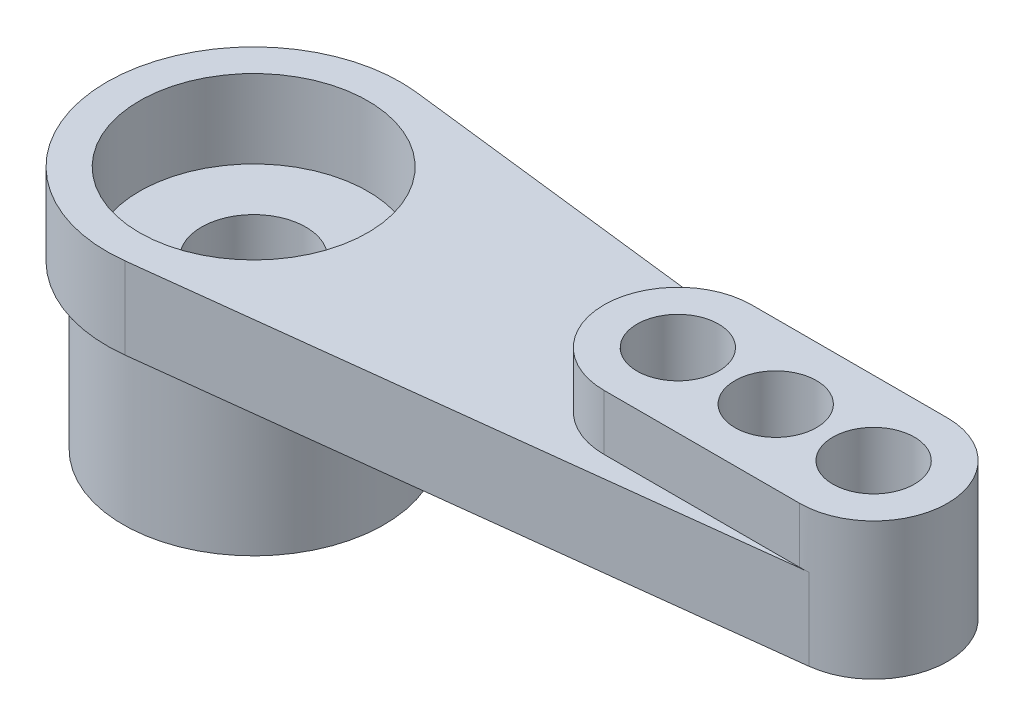
ISO-10303-21;
HEADER;
FILE_DESCRIPTION(('STEP AP214'),'2;1');
FILE_NAME('part.step','',(''),(''),'','','');
FILE_SCHEMA(('AUTOMOTIVE_DESIGN { 1 0 10303 214 1 1 1 1 }'));
ENDSEC;
DATA;
#1=APPLICATION_CONTEXT('core data for automotive mechanical design processes');
#2=APPLICATION_PROTOCOL_DEFINITION('international standard','automotive_design',2000,#1);
#3=PRODUCT_CONTEXT('',#1,'mechanical');
#4=PRODUCT('Part','Part','',(#3));
#5=PRODUCT_RELATED_PRODUCT_CATEGORY('part','',(#4));
#6=PRODUCT_DEFINITION_FORMATION('','',#4);
#7=PRODUCT_DEFINITION_CONTEXT('part definition',#1,'design');
#8=PRODUCT_DEFINITION('design','',#6,#7);
#9=PRODUCT_DEFINITION_SHAPE('','',#8);
#10=(LENGTH_UNIT() NAMED_UNIT(*) SI_UNIT(.MILLI.,.METRE.));
#11=(NAMED_UNIT(*) PLANE_ANGLE_UNIT() SI_UNIT($,.RADIAN.));
#12=(NAMED_UNIT(*) SI_UNIT($,.STERADIAN.) SOLID_ANGLE_UNIT());
#13=UNCERTAINTY_MEASURE_WITH_UNIT(LENGTH_MEASURE(1.E-05),#10,'distance_accuracy_value','');
#14=(GEOMETRIC_REPRESENTATION_CONTEXT(3) GLOBAL_UNCERTAINTY_ASSIGNED_CONTEXT((#13)) GLOBAL_UNIT_ASSIGNED_CONTEXT((#10,
#11,#12)) REPRESENTATION_CONTEXT('',''));
#15=CARTESIAN_POINT('',(0.,0.,0.));
#16=DIRECTION('',(0.,0.,1.));
#17=DIRECTION('',(1.,0.,0.));
#18=AXIS2_PLACEMENT_3D('',#15,#16,#17);
#19=CARTESIAN_POINT('',(0.,2.5,0.));
#20=DIRECTION('',(0.,-1.,0.));
#21=DIRECTION('',(0.,0.,-1.));
#22=AXIS2_PLACEMENT_3D('',#19,#20,#21);
#23=CYLINDRICAL_SURFACE('',#22,4.5);
#24=CARTESIAN_POINT('',(0.,0.,0.));
#25=DIRECTION('',(0.,1.,0.));
#26=DIRECTION('',(0.,0.,1.));
#27=AXIS2_PLACEMENT_3D('',#24,#25,#26);
#28=CIRCLE('',#27,4.5);
#29=CARTESIAN_POINT('',(0.529171571059011,0.,-4.46877807105957));
#30=VERTEX_POINT('',#29);
#31=CARTESIAN_POINT('',(0.529171571059011,0.,4.46877807105957));
#32=VERTEX_POINT('',#31);
#33=EDGE_CURVE('E144',#30,#32,#28,.T.);
#34=ORIENTED_EDGE('',*,*,#33,.T.);
#35=DIRECTION('',(0.,-1.,0.));
#36=VECTOR('',#35,1.);
#37=CARTESIAN_POINT('',(0.529171571059011,2.5,4.46877807105957));
#38=LINE('',#37,#36);
#39=CARTESIAN_POINT('',(0.529171571059011,2.5,4.46877807105957));
#40=VERTEX_POINT('',#39);
#41=EDGE_CURVE('E147',#40,#32,#38,.T.);
#42=ORIENTED_EDGE('',*,*,#41,.F.);
#43=CARTESIAN_POINT('',(0.,2.5,0.));
#44=DIRECTION('',(0.,1.,0.));
#45=DIRECTION('',(0.,0.,1.));
#46=AXIS2_PLACEMENT_3D('',#43,#44,#45);
#47=CIRCLE('',#46,4.5);
#48=CARTESIAN_POINT('',(0.529171571059011,2.5,-4.46877807105957));
#49=VERTEX_POINT('',#48);
#50=EDGE_CURVE('E148',#49,#40,#47,.T.);
#51=ORIENTED_EDGE('',*,*,#50,.F.);
#52=DIRECTION('',(0.,-1.,0.));
#53=VECTOR('',#52,1.);
#54=CARTESIAN_POINT('',(0.529171571059011,2.5,-4.46877807105957));
#55=LINE('',#54,#53);
#56=EDGE_CURVE('E156',#49,#30,#55,.T.);
#57=ORIENTED_EDGE('',*,*,#56,.T.);
#58=EDGE_LOOP('',(#34,#42,#51,#57));
#59=FACE_BOUND('',#58,.T.);
#60=ADVANCED_FACE('F33',(#59),#23,.T.);
#61=CARTESIAN_POINT('',(0.529171571059011,2.5,4.46877807105957));
#62=DIRECTION('',(-0.117593682457558,0.,-0.993061793568795));
#63=DIRECTION('',(-0.993061793568795,0.,0.117593682457558));
#64=AXIS2_PLACEMENT_3D('',#61,#62,#63);
#65=PLANE('',#64);
#66=DIRECTION('',(0.993061793568795,0.,-0.117593682457558));
#67=VECTOR('',#66,1.);
#68=CARTESIAN_POINT('',(0.529171571059011,0.,4.46877807105957));
#69=LINE('',#68,#67);
#70=CARTESIAN_POINT('',(19.2664343621344,0.,2.25));
#71=VERTEX_POINT('',#70);
#72=EDGE_CURVE('E159',#32,#71,#69,.T.);
#73=ORIENTED_EDGE('',*,*,#72,.T.);
#74=DIRECTION('',(0.,-1.,0.));
#75=VECTOR('',#74,1.);
#76=CARTESIAN_POINT('',(19.2664343621344,2.5,2.25));
#77=LINE('',#76,#75);
#78=CARTESIAN_POINT('',(19.2664343621344,2.5,2.25));
#79=VERTEX_POINT('',#78);
#80=EDGE_CURVE('E169',#79,#71,#77,.T.);
#81=ORIENTED_EDGE('',*,*,#80,.F.);
#82=DIRECTION('',(0.993061793568795,0.,-0.117593682457558));
#83=VECTOR('',#82,1.);
#84=CARTESIAN_POINT('',(0.529171571059011,2.5,4.46877807105957));
#85=LINE('',#84,#83);
#86=EDGE_CURVE('E151',#40,#79,#85,.T.);
#87=ORIENTED_EDGE('',*,*,#86,.F.);
#88=ORIENTED_EDGE('',*,*,#41,.T.);
#89=EDGE_LOOP('',(#73,#81,#87,#88));
#90=FACE_BOUND('',#89,.T.);
#91=ADVANCED_FACE('F221',(#90),#65,.F.);
#92=CARTESIAN_POINT('',(19.,2.5,0.));
#93=DIRECTION('',(0.,-1.,0.));
#94=DIRECTION('',(0.,0.,-1.));
#95=AXIS2_PLACEMENT_3D('',#92,#93,#94);
#96=CYLINDRICAL_SURFACE('',#95,2.2657200333064);
#97=CARTESIAN_POINT('',(19.,0.,0.));
#98=DIRECTION('',(0.,1.,0.));
#99=DIRECTION('',(0.,0.,-1.));
#100=AXIS2_PLACEMENT_3D('',#97,#98,#99);
#101=CIRCLE('',#100,2.2657200333064);
#102=CARTESIAN_POINT('',(19.2664343621344,0.,-2.25));
#103=VERTEX_POINT('',#102);
#104=EDGE_CURVE('E161',#71,#103,#101,.T.);
#105=ORIENTED_EDGE('',*,*,#104,.T.);
#106=DIRECTION('',(0.,-1.,0.));
#107=VECTOR('',#106,1.);
#108=CARTESIAN_POINT('',(19.2664343621344,2.5,-2.25));
#109=LINE('',#108,#107);
#110=CARTESIAN_POINT('',(19.2664343621344,2.5,-2.25));
#111=VERTEX_POINT('',#110);
#112=EDGE_CURVE('E166',#111,#103,#109,.T.);
#113=ORIENTED_EDGE('',*,*,#112,.F.);
#114=CARTESIAN_POINT('',(19.,2.5,0.));
#115=DIRECTION('',(0.,1.,0.));
#116=DIRECTION('',(0.,0.,1.));
#117=AXIS2_PLACEMENT_3D('',#114,#115,#116);
#118=CIRCLE('',#117,2.2657200333064);
#119=CARTESIAN_POINT('',(19.,2.5,-2.2657200333064));
#120=VERTEX_POINT('',#119);
#121=EDGE_CURVE('E11',#111,#120,#118,.T.);
#122=ORIENTED_EDGE('',*,*,#121,.T.);
#123=DIRECTION('',(0.,-1.,0.));
#124=VECTOR('',#123,1.);
#125=CARTESIAN_POINT('',(19.,4.2,-2.2657200333064));
#126=LINE('',#125,#124);
#127=CARTESIAN_POINT('',(19.,4.2,-2.2657200333064));
#128=VERTEX_POINT('',#127);
#129=EDGE_CURVE('E102',#128,#120,#126,.T.);
#130=ORIENTED_EDGE('',*,*,#129,.F.);
#131=CARTESIAN_POINT('',(19.,4.2,0.));
#132=DIRECTION('',(0.,1.,0.));
#133=DIRECTION('',(0.,0.,1.));
#134=AXIS2_PLACEMENT_3D('',#131,#132,#133);
#135=CIRCLE('',#134,2.2657200333064);
#136=CARTESIAN_POINT('',(19.,4.2,2.2657200333064));
#137=VERTEX_POINT('',#136);
#138=EDGE_CURVE('E108',#137,#128,#135,.T.);
#139=ORIENTED_EDGE('',*,*,#138,.F.);
#140=DIRECTION('',(0.,-1.,0.));
#141=VECTOR('',#140,1.);
#142=CARTESIAN_POINT('',(19.,4.2,2.2657200333064));
#143=LINE('',#142,#141);
#144=CARTESIAN_POINT('',(19.,2.5,2.2657200333064));
#145=VERTEX_POINT('',#144);
#146=EDGE_CURVE('E231',#137,#145,#143,.T.);
#147=ORIENTED_EDGE('',*,*,#146,.T.);
#148=EDGE_CURVE('E43',#145,#79,#118,.T.);
#149=ORIENTED_EDGE('',*,*,#148,.T.);
#150=ORIENTED_EDGE('',*,*,#80,.T.);
#151=EDGE_LOOP('',(#105,#113,#122,#130,#139,#147,#149,#150));
#152=FACE_BOUND('',#151,.T.);
#153=ADVANCED_FACE('F118',(#152),#96,.T.);
#154=CARTESIAN_POINT('',(0.529171571059011,2.5,-4.46877807105957));
#155=DIRECTION('',(-0.117593682457558,0.,0.993061793568795));
#156=DIRECTION('',(0.993061793568795,0.,0.117593682457558));
#157=AXIS2_PLACEMENT_3D('',#154,#155,#156);
#158=PLANE('',#157);
#159=DIRECTION('',(-0.993061793568795,0.,-0.117593682457558));
#160=VECTOR('',#159,1.);
#161=CARTESIAN_POINT('',(0.529171571059011,0.,-4.46877807105957));
#162=LINE('',#161,#160);
#163=EDGE_CURVE('E152',#103,#30,#162,.T.);
#164=ORIENTED_EDGE('',*,*,#163,.T.);
#165=ORIENTED_EDGE('',*,*,#56,.F.);
#166=DIRECTION('',(-0.993061793568795,0.,-0.117593682457558));
#167=VECTOR('',#166,1.);
#168=CARTESIAN_POINT('',(0.529171571059011,2.5,-4.46877807105957));
#169=LINE('',#168,#167);
#170=EDGE_CURVE('E154',#111,#49,#169,.T.);
#171=ORIENTED_EDGE('',*,*,#170,.F.);
#172=ORIENTED_EDGE('',*,*,#112,.T.);
#173=EDGE_LOOP('',(#164,#165,#171,#172));
#174=FACE_BOUND('',#173,.T.);
#175=ADVANCED_FACE('F218',(#174),#158,.F.);
#176=CARTESIAN_POINT('',(0.,2.5,0.));
#177=DIRECTION('',(0.,1.,0.));
#178=DIRECTION('',(0.,0.,1.));
#179=AXIS2_PLACEMENT_3D('',#176,#177,#178);
#180=PLANE('',#179);
#181=ORIENTED_EDGE('',*,*,#148,.F.);
#182=DIRECTION('',(1.,0.,0.));
#183=VECTOR('',#182,1.);
#184=CARTESIAN_POINT('',(19.,2.5,2.2657200333064));
#185=LINE('',#184,#183);
#186=CARTESIAN_POINT('',(13.,2.5,2.2657200333064));
#187=VERTEX_POINT('',#186);
#188=EDGE_CURVE('E53',#187,#145,#185,.T.);
#189=ORIENTED_EDGE('',*,*,#188,.F.);
#190=CARTESIAN_POINT('',(13.,2.5,0.));
#191=DIRECTION('',(0.,1.,0.));
#192=DIRECTION('',(0.,0.,1.));
#193=AXIS2_PLACEMENT_3D('',#190,#191,#192);
#194=CIRCLE('',#193,2.2657200333064);
#195=CARTESIAN_POINT('',(13.,2.5,-2.2657200333064));
#196=VERTEX_POINT('',#195);
#197=EDGE_CURVE('E224',#196,#187,#194,.T.);
#198=ORIENTED_EDGE('',*,*,#197,.F.);
#199=DIRECTION('',(-1.,0.,0.));
#200=VECTOR('',#199,1.);
#201=CARTESIAN_POINT('',(19.,2.5,-2.2657200333064));
#202=LINE('',#201,#200);
#203=EDGE_CURVE('E223',#120,#196,#202,.T.);
#204=ORIENTED_EDGE('',*,*,#203,.F.);
#205=ORIENTED_EDGE('',*,*,#121,.F.);
#206=ORIENTED_EDGE('',*,*,#170,.T.);
#207=ORIENTED_EDGE('',*,*,#50,.T.);
#208=ORIENTED_EDGE('',*,*,#86,.T.);
#209=EDGE_LOOP('',(#181,#189,#198,#204,#205,#206,#207,#208));
#210=FACE_BOUND('',#209,.T.);
#211=CARTESIAN_POINT('',(0.,2.5,0.));
#212=DIRECTION('',(0.,1.,0.));
#213=DIRECTION('',(0.,0.,1.));
#214=AXIS2_PLACEMENT_3D('',#211,#212,#213);
#215=CIRCLE('',#214,3.5);
#216=CARTESIAN_POINT('',(0.,2.5,3.5));
#217=VERTEX_POINT('',#216);
#218=EDGE_CURVE('E120',#217,#217,#215,.T.);
#219=ORIENTED_EDGE('',*,*,#218,.F.);
#220=EDGE_LOOP('',(#219));
#221=FACE_BOUND('',#220,.T.);
#222=ADVANCED_FACE('F206',(#210,#221),#180,.T.);
#223=CARTESIAN_POINT('',(0.,0.,0.));
#224=DIRECTION('',(0.,1.,0.));
#225=DIRECTION('',(0.,0.,1.));
#226=AXIS2_PLACEMENT_3D('',#223,#224,#225);
#227=PLANE('',#226);
#228=CARTESIAN_POINT('',(13.,0.,0.));
#229=DIRECTION('',(0.,1.,0.));
#230=DIRECTION('',(0.,0.,1.));
#231=AXIS2_PLACEMENT_3D('',#228,#229,#230);
#232=CIRCLE('',#231,1.24999999999999);
#233=CARTESIAN_POINT('',(13.,0.,1.24999999999999));
#234=VERTEX_POINT('',#233);
#235=EDGE_CURVE('E248',#234,#234,#232,.T.);
#236=ORIENTED_EDGE('',*,*,#235,.T.);
#237=EDGE_LOOP('',(#236));
#238=FACE_BOUND('',#237,.T.);
#239=CARTESIAN_POINT('',(16.,0.,0.));
#240=DIRECTION('',(0.,1.,0.));
#241=DIRECTION('',(0.,0.,1.));
#242=AXIS2_PLACEMENT_3D('',#239,#240,#241);
#243=CIRCLE('',#242,1.24999999999999);
#244=CARTESIAN_POINT('',(16.,0.,1.24999999999999));
#245=VERTEX_POINT('',#244);
#246=EDGE_CURVE('E36',#245,#245,#243,.T.);
#247=ORIENTED_EDGE('',*,*,#246,.T.);
#248=EDGE_LOOP('',(#247));
#249=FACE_BOUND('',#248,.T.);
#250=CARTESIAN_POINT('',(19.,0.,0.));
#251=DIRECTION('',(0.,1.,0.));
#252=DIRECTION('',(0.,0.,1.));
#253=AXIS2_PLACEMENT_3D('',#250,#251,#252);
#254=CIRCLE('',#253,1.24999999999999);
#255=CARTESIAN_POINT('',(19.,0.,1.24999999999999));
#256=VERTEX_POINT('',#255);
#257=EDGE_CURVE('E227',#256,#256,#254,.T.);
#258=ORIENTED_EDGE('',*,*,#257,.T.);
#259=EDGE_LOOP('',(#258));
#260=FACE_BOUND('',#259,.T.);
#261=CARTESIAN_POINT('',(0.,0.,0.));
#262=DIRECTION('',(0.,-1.,0.));
#263=DIRECTION('',(0.,0.,-1.));
#264=AXIS2_PLACEMENT_3D('',#261,#262,#263);
#265=CIRCLE('',#264,4.);
#266=CARTESIAN_POINT('',(0.,0.,-4.));
#267=VERTEX_POINT('',#266);
#268=EDGE_CURVE('E41',#267,#267,#265,.T.);
#269=ORIENTED_EDGE('',*,*,#268,.F.);
#270=EDGE_LOOP('',(#269));
#271=FACE_BOUND('',#270,.T.);
#272=ORIENTED_EDGE('',*,*,#33,.F.);
#273=ORIENTED_EDGE('',*,*,#163,.F.);
#274=ORIENTED_EDGE('',*,*,#104,.F.);
#275=ORIENTED_EDGE('',*,*,#72,.F.);
#276=EDGE_LOOP('',(#272,#273,#274,#275));
#277=FACE_BOUND('',#276,.T.);
#278=ADVANCED_FACE('F200',(#238,#249,#260,#271,#277),#227,.F.);
#279=CARTESIAN_POINT('',(0.,-5.,0.));
#280=DIRECTION('',(0.,1.,0.));
#281=DIRECTION('',(0.,0.,1.));
#282=AXIS2_PLACEMENT_3D('',#279,#280,#281);
#283=CYLINDRICAL_SURFACE('',#282,4.);
#284=CARTESIAN_POINT('',(0.,-5.,0.));
#285=DIRECTION('',(0.,-1.,0.));
#286=DIRECTION('',(0.,0.,-1.));
#287=AXIS2_PLACEMENT_3D('',#284,#285,#286);
#288=CIRCLE('',#287,4.);
#289=CARTESIAN_POINT('',(0.,-5.,-4.));
#290=VERTEX_POINT('',#289);
#291=EDGE_CURVE('E138',#290,#290,#288,.T.);
#292=ORIENTED_EDGE('',*,*,#291,.F.);
#293=EDGE_LOOP('',(#292));
#294=FACE_BOUND('',#293,.T.);
#295=ORIENTED_EDGE('',*,*,#268,.T.);
#296=EDGE_LOOP('',(#295));
#297=FACE_BOUND('',#296,.T.);
#298=ADVANCED_FACE('F194',(#294,#297),#283,.T.);
#299=CARTESIAN_POINT('',(0.,-5.,0.));
#300=DIRECTION('',(0.,-1.,0.));
#301=DIRECTION('',(0.,0.,-1.));
#302=AXIS2_PLACEMENT_3D('',#299,#300,#301);
#303=PLANE('',#302);
#304=CARTESIAN_POINT('',(0.,-5.,0.));
#305=DIRECTION('',(0.,-1.,0.));
#306=DIRECTION('',(0.,0.,-1.));
#307=AXIS2_PLACEMENT_3D('',#304,#305,#306);
#308=CIRCLE('',#307,2.7);
#309=CARTESIAN_POINT('',(0.,-5.,-2.7));
#310=VERTEX_POINT('',#309);
#311=EDGE_CURVE('E139',#310,#310,#308,.T.);
#312=ORIENTED_EDGE('',*,*,#311,.F.);
#313=EDGE_LOOP('',(#312));
#314=FACE_BOUND('',#313,.T.);
#315=ORIENTED_EDGE('',*,*,#291,.T.);
#316=EDGE_LOOP('',(#315));
#317=FACE_BOUND('',#316,.T.);
#318=ADVANCED_FACE('F188',(#314,#317),#303,.T.);
#319=CARTESIAN_POINT('',(0.,-2.6,0.));
#320=DIRECTION('',(0.,-1.,0.));
#321=DIRECTION('',(0.,0.,-1.));
#322=AXIS2_PLACEMENT_3D('',#319,#320,#321);
#323=CYLINDRICAL_SURFACE('',#322,2.7);
#324=CARTESIAN_POINT('',(0.,-2.6,0.));
#325=DIRECTION('',(0.,-1.,0.));
#326=DIRECTION('',(0.,0.,-1.));
#327=AXIS2_PLACEMENT_3D('',#324,#325,#326);
#328=CIRCLE('',#327,2.7);
#329=CARTESIAN_POINT('',(0.,-2.6,-2.7));
#330=VERTEX_POINT('',#329);
#331=EDGE_CURVE('E135',#330,#330,#328,.T.);
#332=ORIENTED_EDGE('',*,*,#331,.F.);
#333=EDGE_LOOP('',(#332));
#334=FACE_BOUND('',#333,.T.);
#335=ORIENTED_EDGE('',*,*,#311,.T.);
#336=EDGE_LOOP('',(#335));
#337=FACE_BOUND('',#336,.T.);
#338=ADVANCED_FACE('F182',(#334,#337),#323,.F.);
#339=CARTESIAN_POINT('',(0.,-2.6,0.));
#340=DIRECTION('',(0.,-1.,0.));
#341=DIRECTION('',(0.,0.,-1.));
#342=AXIS2_PLACEMENT_3D('',#339,#340,#341);
#343=PLANE('',#342);
#344=CARTESIAN_POINT('',(0.,-2.6,0.));
#345=DIRECTION('',(0.,-1.,0.));
#346=DIRECTION('',(0.,0.,-1.));
#347=AXIS2_PLACEMENT_3D('',#344,#345,#346);
#348=CIRCLE('',#347,1.6);
#349=CARTESIAN_POINT('',(0.,-2.6,-1.6));
#350=VERTEX_POINT('',#349);
#351=EDGE_CURVE('E134',#350,#350,#348,.T.);
#352=ORIENTED_EDGE('',*,*,#351,.F.);
#353=EDGE_LOOP('',(#352));
#354=FACE_BOUND('',#353,.T.);
#355=ORIENTED_EDGE('',*,*,#331,.T.);
#356=EDGE_LOOP('',(#355));
#357=FACE_BOUND('',#356,.T.);
#358=ADVANCED_FACE('F179',(#354,#357),#343,.T.);
#359=CARTESIAN_POINT('',(0.,2.5,0.));
#360=DIRECTION('',(0.,1.,0.));
#361=DIRECTION('',(0.,0.,1.));
#362=AXIS2_PLACEMENT_3D('',#359,#360,#361);
#363=CYLINDRICAL_SURFACE('',#362,1.6);
#364=ORIENTED_EDGE('',*,*,#351,.T.);
#365=EDGE_LOOP('',(#364));
#366=FACE_BOUND('',#365,.T.);
#367=CARTESIAN_POINT('',(0.,0.100000000000001,0.));
#368=DIRECTION('',(0.,1.,0.));
#369=DIRECTION('',(0.,0.,1.));
#370=AXIS2_PLACEMENT_3D('',#367,#368,#369);
#371=CIRCLE('',#370,1.6);
#372=CARTESIAN_POINT('',(0.,0.100000000000001,1.6));
#373=VERTEX_POINT('',#372);
#374=EDGE_CURVE('E131',#373,#373,#371,.T.);
#375=ORIENTED_EDGE('',*,*,#374,.T.);
#376=EDGE_LOOP('',(#375));
#377=FACE_BOUND('',#376,.T.);
#378=ADVANCED_FACE('F176',(#366,#377),#363,.F.);
#379=CARTESIAN_POINT('',(1.6,0.100000000000001,0.));
#380=DIRECTION('',(0.,-1.,0.));
#381=DIRECTION('',(0.,0.,-1.));
#382=AXIS2_PLACEMENT_3D('',#379,#380,#381);
#383=PLANE('',#382);
#384=ORIENTED_EDGE('',*,*,#374,.F.);
#385=EDGE_LOOP('',(#384));
#386=FACE_BOUND('',#385,.T.);
#387=CARTESIAN_POINT('',(0.,0.100000000000001,0.));
#388=DIRECTION('',(0.,1.,0.));
#389=DIRECTION('',(0.,0.,1.));
#390=AXIS2_PLACEMENT_3D('',#387,#388,#389);
#391=CIRCLE('',#390,3.5);
#392=CARTESIAN_POINT('',(0.,0.100000000000001,3.5));
#393=VERTEX_POINT('',#392);
#394=EDGE_CURVE('E123',#393,#393,#391,.T.);
#395=ORIENTED_EDGE('',*,*,#394,.T.);
#396=EDGE_LOOP('',(#395));
#397=FACE_BOUND('',#396,.T.);
#398=ADVANCED_FACE('F292',(#386,#397),#383,.F.);
#399=CARTESIAN_POINT('',(0.,2.5,0.));
#400=DIRECTION('',(0.,1.,0.));
#401=DIRECTION('',(0.,0.,1.));
#402=AXIS2_PLACEMENT_3D('',#399,#400,#401);
#403=CYLINDRICAL_SURFACE('',#402,3.5);
#404=ORIENTED_EDGE('',*,*,#394,.F.);
#405=EDGE_LOOP('',(#404));
#406=FACE_BOUND('',#405,.T.);
#407=ORIENTED_EDGE('',*,*,#218,.T.);
#408=EDGE_LOOP('',(#407));
#409=FACE_BOUND('',#408,.T.);
#410=ADVANCED_FACE('F295',(#406,#409),#403,.F.);
#411=CARTESIAN_POINT('',(19.,4.2,-2.2657200333064));
#412=DIRECTION('',(0.,0.,1.));
#413=DIRECTION('',(1.,0.,0.));
#414=AXIS2_PLACEMENT_3D('',#411,#412,#413);
#415=PLANE('',#414);
#416=ORIENTED_EDGE('',*,*,#203,.T.);
#417=DIRECTION('',(0.,-1.,0.));
#418=VECTOR('',#417,1.);
#419=CARTESIAN_POINT('',(13.,4.2,-2.2657200333064));
#420=LINE('',#419,#418);
#421=CARTESIAN_POINT('',(13.,4.2,-2.2657200333064));
#422=VERTEX_POINT('',#421);
#423=EDGE_CURVE('E104',#422,#196,#420,.T.);
#424=ORIENTED_EDGE('',*,*,#423,.F.);
#425=DIRECTION('',(-1.,0.,0.));
#426=VECTOR('',#425,1.);
#427=CARTESIAN_POINT('',(19.,4.2,-2.2657200333064));
#428=LINE('',#427,#426);
#429=EDGE_CURVE('E97',#128,#422,#428,.T.);
#430=ORIENTED_EDGE('',*,*,#429,.F.);
#431=ORIENTED_EDGE('',*,*,#129,.T.);
#432=EDGE_LOOP('',(#416,#424,#430,#431));
#433=FACE_BOUND('',#432,.T.);
#434=ADVANCED_FACE('F100',(#433),#415,.F.);
#435=CARTESIAN_POINT('',(13.,4.2,0.));
#436=DIRECTION('',(0.,-1.,0.));
#437=DIRECTION('',(0.,0.,-1.));
#438=AXIS2_PLACEMENT_3D('',#435,#436,#437);
#439=CYLINDRICAL_SURFACE('',#438,2.2657200333064);
#440=ORIENTED_EDGE('',*,*,#197,.T.);
#441=DIRECTION('',(0.,-1.,0.));
#442=VECTOR('',#441,1.);
#443=CARTESIAN_POINT('',(13.,4.2,2.2657200333064));
#444=LINE('',#443,#442);
#445=CARTESIAN_POINT('',(13.,4.2,2.2657200333064));
#446=VERTEX_POINT('',#445);
#447=EDGE_CURVE('E125',#446,#187,#444,.T.);
#448=ORIENTED_EDGE('',*,*,#447,.F.);
#449=CARTESIAN_POINT('',(13.,4.2,0.));
#450=DIRECTION('',(0.,1.,0.));
#451=DIRECTION('',(0.,0.,1.));
#452=AXIS2_PLACEMENT_3D('',#449,#450,#451);
#453=CIRCLE('',#452,2.2657200333064);
#454=EDGE_CURVE('E107',#422,#446,#453,.T.);
#455=ORIENTED_EDGE('',*,*,#454,.F.);
#456=ORIENTED_EDGE('',*,*,#423,.T.);
#457=EDGE_LOOP('',(#440,#448,#455,#456));
#458=FACE_BOUND('',#457,.T.);
#459=ADVANCED_FACE('F237',(#458),#439,.T.);
#460=CARTESIAN_POINT('',(19.,4.2,2.2657200333064));
#461=DIRECTION('',(0.,0.,-1.));
#462=DIRECTION('',(-1.,0.,0.));
#463=AXIS2_PLACEMENT_3D('',#460,#461,#462);
#464=PLANE('',#463);
#465=ORIENTED_EDGE('',*,*,#188,.T.);
#466=ORIENTED_EDGE('',*,*,#146,.F.);
#467=DIRECTION('',(1.,0.,0.));
#468=VECTOR('',#467,1.);
#469=CARTESIAN_POINT('',(19.,4.2,2.2657200333064));
#470=LINE('',#469,#468);
#471=EDGE_CURVE('E113',#446,#137,#470,.T.);
#472=ORIENTED_EDGE('',*,*,#471,.F.);
#473=ORIENTED_EDGE('',*,*,#447,.T.);
#474=EDGE_LOOP('',(#465,#466,#472,#473));
#475=FACE_BOUND('',#474,.T.);
#476=ADVANCED_FACE('F235',(#475),#464,.F.);
#477=CARTESIAN_POINT('',(19.,4.2,0.));
#478=DIRECTION('',(0.,1.,0.));
#479=DIRECTION('',(0.,0.,1.));
#480=AXIS2_PLACEMENT_3D('',#477,#478,#479);
#481=PLANE('',#480);
#482=CARTESIAN_POINT('',(13.,4.2,0.));
#483=DIRECTION('',(0.,1.,0.));
#484=DIRECTION('',(0.,0.,1.));
#485=AXIS2_PLACEMENT_3D('',#482,#483,#484);
#486=CIRCLE('',#485,1.24999999999999);
#487=CARTESIAN_POINT('',(13.,4.2,1.24999999999999));
#488=VERTEX_POINT('',#487);
#489=EDGE_CURVE('E251',#488,#488,#486,.T.);
#490=ORIENTED_EDGE('',*,*,#489,.F.);
#491=EDGE_LOOP('',(#490));
#492=FACE_BOUND('',#491,.T.);
#493=CARTESIAN_POINT('',(16.,4.2,0.));
#494=DIRECTION('',(0.,1.,0.));
#495=DIRECTION('',(0.,0.,1.));
#496=AXIS2_PLACEMENT_3D('',#493,#494,#495);
#497=CIRCLE('',#496,1.24999999999999);
#498=CARTESIAN_POINT('',(16.,4.2,1.24999999999999));
#499=VERTEX_POINT('',#498);
#500=EDGE_CURVE('E245',#499,#499,#497,.T.);
#501=ORIENTED_EDGE('',*,*,#500,.F.);
#502=EDGE_LOOP('',(#501));
#503=FACE_BOUND('',#502,.T.);
#504=CARTESIAN_POINT('',(19.,4.2,0.));
#505=DIRECTION('',(0.,1.,0.));
#506=DIRECTION('',(0.,0.,1.));
#507=AXIS2_PLACEMENT_3D('',#504,#505,#506);
#508=CIRCLE('',#507,1.24999999999999);
#509=CARTESIAN_POINT('',(19.,4.2,1.24999999999999));
#510=VERTEX_POINT('',#509);
#511=EDGE_CURVE('E242',#510,#510,#508,.T.);
#512=ORIENTED_EDGE('',*,*,#511,.F.);
#513=EDGE_LOOP('',(#512));
#514=FACE_BOUND('',#513,.T.);
#515=ORIENTED_EDGE('',*,*,#138,.T.);
#516=ORIENTED_EDGE('',*,*,#429,.T.);
#517=ORIENTED_EDGE('',*,*,#454,.T.);
#518=ORIENTED_EDGE('',*,*,#471,.T.);
#519=EDGE_LOOP('',(#515,#516,#517,#518));
#520=FACE_BOUND('',#519,.T.);
#521=ADVANCED_FACE('F111',(#492,#503,#514,#520),#481,.T.);
#522=CARTESIAN_POINT('',(19.,4.2,0.));
#523=DIRECTION('',(0.,1.,0.));
#524=DIRECTION('',(0.,0.,1.));
#525=AXIS2_PLACEMENT_3D('',#522,#523,#524);
#526=CYLINDRICAL_SURFACE('',#525,1.24999999999999);
#527=ORIENTED_EDGE('',*,*,#511,.T.);
#528=EDGE_LOOP('',(#527));
#529=FACE_BOUND('',#528,.T.);
#530=ORIENTED_EDGE('',*,*,#257,.F.);
#531=EDGE_LOOP('',(#530));
#532=FACE_BOUND('',#531,.T.);
#533=ADVANCED_FACE('F260',(#529,#532),#526,.F.);
#534=CARTESIAN_POINT('',(16.,4.2,0.));
#535=DIRECTION('',(0.,1.,0.));
#536=DIRECTION('',(0.,0.,1.));
#537=AXIS2_PLACEMENT_3D('',#534,#535,#536);
#538=CYLINDRICAL_SURFACE('',#537,1.24999999999999);
#539=ORIENTED_EDGE('',*,*,#500,.T.);
#540=EDGE_LOOP('',(#539));
#541=FACE_BOUND('',#540,.T.);
#542=ORIENTED_EDGE('',*,*,#246,.F.);
#543=EDGE_LOOP('',(#542));
#544=FACE_BOUND('',#543,.T.);
#545=ADVANCED_FACE('F268',(#541,#544),#538,.F.);
#546=CARTESIAN_POINT('',(13.,4.2,0.));
#547=DIRECTION('',(0.,1.,0.));
#548=DIRECTION('',(0.,0.,1.));
#549=AXIS2_PLACEMENT_3D('',#546,#547,#548);
#550=CYLINDRICAL_SURFACE('',#549,1.24999999999999);
#551=ORIENTED_EDGE('',*,*,#489,.T.);
#552=EDGE_LOOP('',(#551));
#553=FACE_BOUND('',#552,.T.);
#554=ORIENTED_EDGE('',*,*,#235,.F.);
#555=EDGE_LOOP('',(#554));
#556=FACE_BOUND('',#555,.T.);
#557=ADVANCED_FACE('F255',(#553,#556),#550,.F.);
#558=CLOSED_SHELL('',(#60,#91,#153,#175,#222,#278,#298,#318,#338,#358,#378,#398,#410,#434,#459,
#476,#521,#533,#545,#557));
#559=MANIFOLD_SOLID_BREP('B2',#558);
#560=ADVANCED_BREP_SHAPE_REPRESENTATION('',(#18,#559),#14);
#561=SHAPE_DEFINITION_REPRESENTATION(#9,#560);
ENDSEC;
END-ISO-10303-21;
